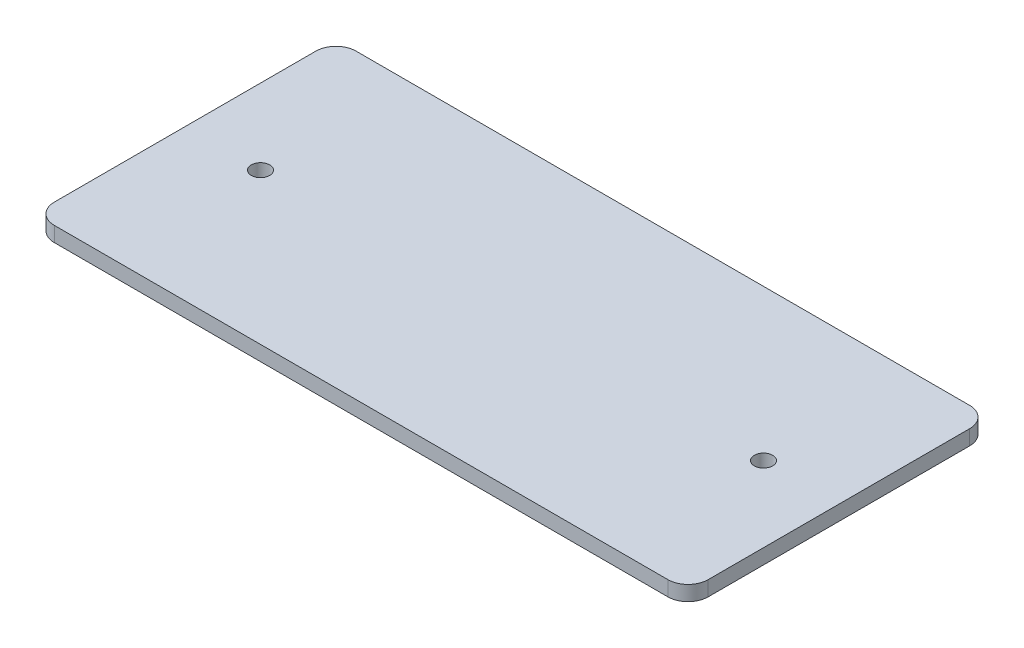
ISO-10303-21;
HEADER;
FILE_DESCRIPTION(('STEP AP214'),'2;1');
FILE_NAME('part.step','',(''),(''),'','','');
FILE_SCHEMA(('AUTOMOTIVE_DESIGN { 1 0 10303 214 1 1 1 1 }'));
ENDSEC;
DATA;
#1=APPLICATION_CONTEXT('core data for automotive mechanical design processes');
#2=APPLICATION_PROTOCOL_DEFINITION('international standard','automotive_design',2000,#1);
#3=PRODUCT_CONTEXT('',#1,'mechanical');
#4=PRODUCT('Part','Part','',(#3));
#5=PRODUCT_RELATED_PRODUCT_CATEGORY('part','',(#4));
#6=PRODUCT_DEFINITION_FORMATION('','',#4);
#7=PRODUCT_DEFINITION_CONTEXT('part definition',#1,'design');
#8=PRODUCT_DEFINITION('design','',#6,#7);
#9=PRODUCT_DEFINITION_SHAPE('','',#8);
#10=(LENGTH_UNIT() NAMED_UNIT(*) SI_UNIT(.MILLI.,.METRE.));
#11=(NAMED_UNIT(*) PLANE_ANGLE_UNIT() SI_UNIT($,.RADIAN.));
#12=(NAMED_UNIT(*) SI_UNIT($,.STERADIAN.) SOLID_ANGLE_UNIT());
#13=UNCERTAINTY_MEASURE_WITH_UNIT(LENGTH_MEASURE(1.E-05),#10,'distance_accuracy_value','');
#14=(GEOMETRIC_REPRESENTATION_CONTEXT(3) GLOBAL_UNCERTAINTY_ASSIGNED_CONTEXT((#13)) GLOBAL_UNIT_ASSIGNED_CONTEXT((#10,
#11,#12)) REPRESENTATION_CONTEXT('',''));
#15=CARTESIAN_POINT('',(0.,0.,0.));
#16=DIRECTION('',(0.,0.,1.));
#17=DIRECTION('',(1.,0.,0.));
#18=AXIS2_PLACEMENT_3D('',#15,#16,#17);
#19=CARTESIAN_POINT('',(0.,147.2438,0.));
#20=DIRECTION('',(0.,1.,0.));
#21=DIRECTION('',(0.,0.,1.));
#22=AXIS2_PLACEMENT_3D('',#19,#20,#21);
#23=PLANE('',#22);
#24=CARTESIAN_POINT('',(-50.7957697616357,147.2438,181.505943707725));
#25=DIRECTION('',(0.,1.,0.));
#26=DIRECTION('',(0.,0.,1.));
#27=AXIS2_PLACEMENT_3D('',#24,#25,#26);
#28=CIRCLE('',#27,1.82879999999999);
#29=CARTESIAN_POINT('',(-50.7957697616357,147.2438,183.334743707725));
#30=VERTEX_POINT('',#29);
#31=EDGE_CURVE('E163',#30,#30,#28,.T.);
#32=ORIENTED_EDGE('',*,*,#31,.F.);
#33=EDGE_LOOP('',(#32));
#34=FACE_BOUND('',#33,.T.);
#35=DIRECTION('',(-1.,0.,0.));
#36=VECTOR('',#35,1.);
#37=CARTESIAN_POINT('',(-65.7957697616357,147.2438,151.505943707725));
#38=LINE('',#37,#36);
#39=CARTESIAN_POINT('',(60.2042302383643,147.2438,151.505943707725));
#40=VERTEX_POINT('',#39);
#41=CARTESIAN_POINT('',(-61.7957697616357,147.2438,151.505943707725));
#42=VERTEX_POINT('',#41);
#43=EDGE_CURVE('E170',#40,#42,#38,.T.);
#44=ORIENTED_EDGE('',*,*,#43,.T.);
#45=CARTESIAN_POINT('',(-61.7957697616357,147.2438,155.505943707725));
#46=DIRECTION('',(0.,1.,0.));
#47=DIRECTION('',(0.,0.,1.));
#48=AXIS2_PLACEMENT_3D('',#45,#46,#47);
#49=CIRCLE('',#48,4.);
#50=CARTESIAN_POINT('',(-65.7957697616357,147.2438,155.505943707725));
#51=VERTEX_POINT('',#50);
#52=EDGE_CURVE('E147',#42,#51,#49,.T.);
#53=ORIENTED_EDGE('',*,*,#52,.T.);
#54=DIRECTION('',(0.,0.,1.));
#55=VECTOR('',#54,1.);
#56=CARTESIAN_POINT('',(-65.7957697616357,147.2438,151.505943707725));
#57=LINE('',#56,#55);
#58=CARTESIAN_POINT('',(-65.7957697616357,147.2438,207.505943707725));
#59=VERTEX_POINT('',#58);
#60=EDGE_CURVE('E117',#51,#59,#57,.T.);
#61=ORIENTED_EDGE('',*,*,#60,.T.);
#62=CARTESIAN_POINT('',(-61.7957697616356,147.2438,207.505943707725));
#63=DIRECTION('',(0.,1.,0.));
#64=DIRECTION('',(0.,0.,1.));
#65=AXIS2_PLACEMENT_3D('',#62,#63,#64);
#66=CIRCLE('',#65,4.);
#67=CARTESIAN_POINT('',(-61.7957697616356,147.2438,211.505943707725));
#68=VERTEX_POINT('',#67);
#69=EDGE_CURVE('E54',#59,#68,#66,.T.);
#70=ORIENTED_EDGE('',*,*,#69,.T.);
#71=DIRECTION('',(1.,0.,0.));
#72=VECTOR('',#71,1.);
#73=CARTESIAN_POINT('',(-65.7957697616357,147.2438,211.505943707725));
#74=LINE('',#73,#72);
#75=CARTESIAN_POINT('',(60.2042302383643,147.2438,211.505943707725));
#76=VERTEX_POINT('',#75);
#77=EDGE_CURVE('E133',#68,#76,#74,.T.);
#78=ORIENTED_EDGE('',*,*,#77,.T.);
#79=CARTESIAN_POINT('',(60.2042302383643,147.2438,207.505943707725));
#80=DIRECTION('',(0.,1.,0.));
#81=DIRECTION('',(0.,0.,1.));
#82=AXIS2_PLACEMENT_3D('',#79,#80,#81);
#83=CIRCLE('',#82,4.);
#84=CARTESIAN_POINT('',(64.2042302383643,147.2438,207.505943707725));
#85=VERTEX_POINT('',#84);
#86=EDGE_CURVE('E142',#76,#85,#83,.T.);
#87=ORIENTED_EDGE('',*,*,#86,.T.);
#88=DIRECTION('',(0.,0.,-1.));
#89=VECTOR('',#88,1.);
#90=CARTESIAN_POINT('',(64.2042302383643,147.2438,151.505943707725));
#91=LINE('',#90,#89);
#92=CARTESIAN_POINT('',(64.2042302383643,147.2438,155.505943707725));
#93=VERTEX_POINT('',#92);
#94=EDGE_CURVE('E127',#85,#93,#91,.T.);
#95=ORIENTED_EDGE('',*,*,#94,.T.);
#96=CARTESIAN_POINT('',(60.2042302383643,147.2438,155.505943707725));
#97=DIRECTION('',(0.,1.,0.));
#98=DIRECTION('',(0.,0.,1.));
#99=AXIS2_PLACEMENT_3D('',#96,#97,#98);
#100=CIRCLE('',#99,4.);
#101=EDGE_CURVE('E144',#93,#40,#100,.T.);
#102=ORIENTED_EDGE('',*,*,#101,.T.);
#103=EDGE_LOOP('',(#44,#53,#61,#70,#78,#87,#95,#102));
#104=FACE_BOUND('',#103,.T.);
#105=CARTESIAN_POINT('',(49.2042302383644,147.2438,181.505943707725));
#106=DIRECTION('',(0.,1.,0.));
#107=DIRECTION('',(0.,0.,1.));
#108=AXIS2_PLACEMENT_3D('',#105,#106,#107);
#109=CIRCLE('',#108,1.82879999999999);
#110=CARTESIAN_POINT('',(49.2042302383644,147.2438,183.334743707725));
#111=VERTEX_POINT('',#110);
#112=EDGE_CURVE('E175',#111,#111,#109,.T.);
#113=ORIENTED_EDGE('',*,*,#112,.F.);
#114=EDGE_LOOP('',(#113));
#115=FACE_BOUND('',#114,.T.);
#116=ADVANCED_FACE('F32',(#34,#104,#115),#23,.T.);
#117=CARTESIAN_POINT('',(0.,144.272,0.));
#118=DIRECTION('',(0.,1.,0.));
#119=DIRECTION('',(0.,0.,1.));
#120=AXIS2_PLACEMENT_3D('',#117,#118,#119);
#121=PLANE('',#120);
#122=DIRECTION('',(0.,0.,1.));
#123=VECTOR('',#122,1.);
#124=CARTESIAN_POINT('',(-65.7957697616357,144.272,151.505943707725));
#125=LINE('',#124,#123);
#126=CARTESIAN_POINT('',(-65.7957697616357,144.272,155.505943707725));
#127=VERTEX_POINT('',#126);
#128=CARTESIAN_POINT('',(-65.7957697616357,144.272,207.505943707725));
#129=VERTEX_POINT('',#128);
#130=EDGE_CURVE('E115',#127,#129,#125,.T.);
#131=ORIENTED_EDGE('',*,*,#130,.F.);
#132=CARTESIAN_POINT('',(-61.7957697616357,144.272,155.505943707725));
#133=DIRECTION('',(0.,1.,0.));
#134=DIRECTION('',(0.,0.,1.));
#135=AXIS2_PLACEMENT_3D('',#132,#133,#134);
#136=CIRCLE('',#135,4.);
#137=CARTESIAN_POINT('',(-61.7957697616357,144.272,151.505943707725));
#138=VERTEX_POINT('',#137);
#139=EDGE_CURVE('E98',#127,#138,#136,.F.);
#140=ORIENTED_EDGE('',*,*,#139,.T.);
#141=DIRECTION('',(-1.,0.,0.));
#142=VECTOR('',#141,1.);
#143=CARTESIAN_POINT('',(-65.7957697616357,144.272,151.505943707725));
#144=LINE('',#143,#142);
#145=CARTESIAN_POINT('',(60.2042302383643,144.272,151.505943707725));
#146=VERTEX_POINT('',#145);
#147=EDGE_CURVE('E125',#146,#138,#144,.T.);
#148=ORIENTED_EDGE('',*,*,#147,.F.);
#149=CARTESIAN_POINT('',(60.2042302383643,144.272,155.505943707725));
#150=DIRECTION('',(0.,1.,0.));
#151=DIRECTION('',(0.,0.,1.));
#152=AXIS2_PLACEMENT_3D('',#149,#150,#151);
#153=CIRCLE('',#152,4.);
#154=CARTESIAN_POINT('',(64.2042302383643,144.272,155.505943707725));
#155=VERTEX_POINT('',#154);
#156=EDGE_CURVE('E136',#146,#155,#153,.F.);
#157=ORIENTED_EDGE('',*,*,#156,.T.);
#158=DIRECTION('',(0.,0.,-1.));
#159=VECTOR('',#158,1.);
#160=CARTESIAN_POINT('',(64.2042302383643,144.272,151.505943707725));
#161=LINE('',#160,#159);
#162=CARTESIAN_POINT('',(64.2042302383643,144.272,207.505943707725));
#163=VERTEX_POINT('',#162);
#164=EDGE_CURVE('E129',#163,#155,#161,.T.);
#165=ORIENTED_EDGE('',*,*,#164,.F.);
#166=CARTESIAN_POINT('',(60.2042302383643,144.272,207.505943707725));
#167=DIRECTION('',(0.,1.,0.));
#168=DIRECTION('',(0.,0.,1.));
#169=AXIS2_PLACEMENT_3D('',#166,#167,#168);
#170=CIRCLE('',#169,4.);
#171=CARTESIAN_POINT('',(60.2042302383643,144.272,211.505943707725));
#172=VERTEX_POINT('',#171);
#173=EDGE_CURVE('E118',#163,#172,#170,.F.);
#174=ORIENTED_EDGE('',*,*,#173,.T.);
#175=DIRECTION('',(1.,0.,0.));
#176=VECTOR('',#175,1.);
#177=CARTESIAN_POINT('',(-65.7957697616357,144.272,211.505943707725));
#178=LINE('',#177,#176);
#179=CARTESIAN_POINT('',(-61.7957697616356,144.272,211.505943707725));
#180=VERTEX_POINT('',#179);
#181=EDGE_CURVE('E124',#180,#172,#178,.T.);
#182=ORIENTED_EDGE('',*,*,#181,.F.);
#183=CARTESIAN_POINT('',(-61.7957697616356,144.272,207.505943707725));
#184=DIRECTION('',(0.,1.,0.));
#185=DIRECTION('',(0.,0.,1.));
#186=AXIS2_PLACEMENT_3D('',#183,#184,#185);
#187=CIRCLE('',#186,4.);
#188=EDGE_CURVE('E109',#180,#129,#187,.F.);
#189=ORIENTED_EDGE('',*,*,#188,.T.);
#190=EDGE_LOOP('',(#131,#140,#148,#157,#165,#174,#182,#189));
#191=FACE_BOUND('',#190,.T.);
#192=CARTESIAN_POINT('',(-50.7957697616357,144.272,181.505943707725));
#193=DIRECTION('',(0.,1.,0.));
#194=DIRECTION('',(0.,0.,1.));
#195=AXIS2_PLACEMENT_3D('',#192,#193,#194);
#196=CIRCLE('',#195,1.82879999999999);
#197=CARTESIAN_POINT('',(-50.7957697616357,144.272,183.334743707725));
#198=VERTEX_POINT('',#197);
#199=EDGE_CURVE('E165',#198,#198,#196,.T.);
#200=ORIENTED_EDGE('',*,*,#199,.T.);
#201=EDGE_LOOP('',(#200));
#202=FACE_BOUND('',#201,.T.);
#203=CARTESIAN_POINT('',(49.2042302383644,144.272,181.505943707725));
#204=DIRECTION('',(0.,1.,0.));
#205=DIRECTION('',(0.,0.,1.));
#206=AXIS2_PLACEMENT_3D('',#203,#204,#205);
#207=CIRCLE('',#206,1.82879999999999);
#208=CARTESIAN_POINT('',(49.2042302383644,144.272,183.334743707725));
#209=VERTEX_POINT('',#208);
#210=EDGE_CURVE('E177',#209,#209,#207,.T.);
#211=ORIENTED_EDGE('',*,*,#210,.T.);
#212=EDGE_LOOP('',(#211));
#213=FACE_BOUND('',#212,.T.);
#214=ADVANCED_FACE('F121',(#191,#202,#213),#121,.F.);
#215=CARTESIAN_POINT('',(64.2042302383643,147.2438,151.505943707725));
#216=DIRECTION('',(-1.,0.,0.));
#217=DIRECTION('',(0.,0.,1.));
#218=AXIS2_PLACEMENT_3D('',#215,#216,#217);
#219=PLANE('',#218);
#220=ORIENTED_EDGE('',*,*,#164,.T.);
#221=DIRECTION('',(0.,-1.,0.));
#222=VECTOR('',#221,1.);
#223=CARTESIAN_POINT('',(64.2042302383643,147.2438,155.505943707725));
#224=LINE('',#223,#222);
#225=EDGE_CURVE('E11',#155,#93,#224,.F.);
#226=ORIENTED_EDGE('',*,*,#225,.T.);
#227=ORIENTED_EDGE('',*,*,#94,.F.);
#228=DIRECTION('',(0.,-1.,0.));
#229=VECTOR('',#228,1.);
#230=CARTESIAN_POINT('',(64.2042302383643,147.2438,207.505943707725));
#231=LINE('',#230,#229);
#232=EDGE_CURVE('E40',#85,#163,#231,.T.);
#233=ORIENTED_EDGE('',*,*,#232,.T.);
#234=EDGE_LOOP('',(#220,#226,#227,#233));
#235=FACE_BOUND('',#234,.T.);
#236=ADVANCED_FACE('F158',(#235),#219,.F.);
#237=CARTESIAN_POINT('',(-65.7957697616357,147.2438,151.505943707725));
#238=DIRECTION('',(0.,0.,1.));
#239=DIRECTION('',(1.,0.,0.));
#240=AXIS2_PLACEMENT_3D('',#237,#238,#239);
#241=PLANE('',#240);
#242=ORIENTED_EDGE('',*,*,#147,.T.);
#243=DIRECTION('',(0.,-1.,0.));
#244=VECTOR('',#243,1.);
#245=CARTESIAN_POINT('',(-61.7957697616357,147.2438,151.505943707725));
#246=LINE('',#245,#244);
#247=EDGE_CURVE('E103',#138,#42,#246,.F.);
#248=ORIENTED_EDGE('',*,*,#247,.T.);
#249=ORIENTED_EDGE('',*,*,#43,.F.);
#250=DIRECTION('',(0.,-1.,0.));
#251=VECTOR('',#250,1.);
#252=CARTESIAN_POINT('',(60.2042302383643,147.2438,151.505943707725));
#253=LINE('',#252,#251);
#254=EDGE_CURVE('E108',#40,#146,#253,.T.);
#255=ORIENTED_EDGE('',*,*,#254,.T.);
#256=EDGE_LOOP('',(#242,#248,#249,#255));
#257=FACE_BOUND('',#256,.T.);
#258=ADVANCED_FACE('F203',(#257),#241,.F.);
#259=CARTESIAN_POINT('',(-65.7957697616357,147.2438,151.505943707725));
#260=DIRECTION('',(1.,0.,0.));
#261=DIRECTION('',(0.,0.,-1.));
#262=AXIS2_PLACEMENT_3D('',#259,#260,#261);
#263=PLANE('',#262);
#264=ORIENTED_EDGE('',*,*,#60,.F.);
#265=DIRECTION('',(0.,-1.,0.));
#266=VECTOR('',#265,1.);
#267=CARTESIAN_POINT('',(-65.7957697616357,147.2438,155.505943707725));
#268=LINE('',#267,#266);
#269=EDGE_CURVE('E102',#51,#127,#268,.T.);
#270=ORIENTED_EDGE('',*,*,#269,.T.);
#271=ORIENTED_EDGE('',*,*,#130,.T.);
#272=DIRECTION('',(0.,-1.,0.));
#273=VECTOR('',#272,1.);
#274=CARTESIAN_POINT('',(-65.7957697616357,147.2438,207.505943707725));
#275=LINE('',#274,#273);
#276=EDGE_CURVE('E119',#129,#59,#275,.F.);
#277=ORIENTED_EDGE('',*,*,#276,.T.);
#278=EDGE_LOOP('',(#264,#270,#271,#277));
#279=FACE_BOUND('',#278,.T.);
#280=ADVANCED_FACE('F114',(#279),#263,.F.);
#281=CARTESIAN_POINT('',(-65.7957697616357,147.2438,211.505943707725));
#282=DIRECTION('',(0.,0.,-1.));
#283=DIRECTION('',(-1.,0.,0.));
#284=AXIS2_PLACEMENT_3D('',#281,#282,#283);
#285=PLANE('',#284);
#286=ORIENTED_EDGE('',*,*,#77,.F.);
#287=DIRECTION('',(0.,-1.,0.));
#288=VECTOR('',#287,1.);
#289=CARTESIAN_POINT('',(-61.7957697616356,147.2438,211.505943707725));
#290=LINE('',#289,#288);
#291=EDGE_CURVE('E150',#68,#180,#290,.T.);
#292=ORIENTED_EDGE('',*,*,#291,.T.);
#293=ORIENTED_EDGE('',*,*,#181,.T.);
#294=DIRECTION('',(0.,-1.,0.));
#295=VECTOR('',#294,1.);
#296=CARTESIAN_POINT('',(60.2042302383643,147.2438,211.505943707725));
#297=LINE('',#296,#295);
#298=EDGE_CURVE('E47',#172,#76,#297,.F.);
#299=ORIENTED_EDGE('',*,*,#298,.T.);
#300=EDGE_LOOP('',(#286,#292,#293,#299));
#301=FACE_BOUND('',#300,.T.);
#302=ADVANCED_FACE('F198',(#301),#285,.F.);
#303=CARTESIAN_POINT('',(-50.7957697616357,147.2438,181.505943707725));
#304=DIRECTION('',(0.,-1.,0.));
#305=DIRECTION('',(0.,0.,-1.));
#306=AXIS2_PLACEMENT_3D('',#303,#304,#305);
#307=CYLINDRICAL_SURFACE('',#306,1.82879999999999);
#308=ORIENTED_EDGE('',*,*,#31,.T.);
#309=EDGE_LOOP('',(#308));
#310=FACE_BOUND('',#309,.T.);
#311=ORIENTED_EDGE('',*,*,#199,.F.);
#312=EDGE_LOOP('',(#311));
#313=FACE_BOUND('',#312,.T.);
#314=ADVANCED_FACE('F195',(#310,#313),#307,.F.);
#315=CARTESIAN_POINT('',(49.2042302383644,147.2438,181.505943707725));
#316=DIRECTION('',(0.,-1.,0.));
#317=DIRECTION('',(0.,0.,-1.));
#318=AXIS2_PLACEMENT_3D('',#315,#316,#317);
#319=CYLINDRICAL_SURFACE('',#318,1.82879999999999);
#320=ORIENTED_EDGE('',*,*,#112,.T.);
#321=EDGE_LOOP('',(#320));
#322=FACE_BOUND('',#321,.T.);
#323=ORIENTED_EDGE('',*,*,#210,.F.);
#324=EDGE_LOOP('',(#323));
#325=FACE_BOUND('',#324,.T.);
#326=ADVANCED_FACE('F183',(#322,#325),#319,.F.);
#327=CARTESIAN_POINT('',(-61.7957697616357,147.2438,155.505943707725));
#328=DIRECTION('',(0.,-1.,0.));
#329=DIRECTION('',(0.,0.,-1.));
#330=AXIS2_PLACEMENT_3D('',#327,#328,#329);
#331=CYLINDRICAL_SURFACE('',#330,4.);
#332=ORIENTED_EDGE('',*,*,#52,.F.);
#333=ORIENTED_EDGE('',*,*,#247,.F.);
#334=ORIENTED_EDGE('',*,*,#139,.F.);
#335=ORIENTED_EDGE('',*,*,#269,.F.);
#336=EDGE_LOOP('',(#332,#333,#334,#335));
#337=FACE_BOUND('',#336,.T.);
#338=ADVANCED_FACE('F101',(#337),#331,.T.);
#339=CARTESIAN_POINT('',(-61.7957697616356,147.2438,207.505943707725));
#340=DIRECTION('',(0.,-1.,0.));
#341=DIRECTION('',(0.,0.,-1.));
#342=AXIS2_PLACEMENT_3D('',#339,#340,#341);
#343=CYLINDRICAL_SURFACE('',#342,4.);
#344=ORIENTED_EDGE('',*,*,#69,.F.);
#345=ORIENTED_EDGE('',*,*,#276,.F.);
#346=ORIENTED_EDGE('',*,*,#188,.F.);
#347=ORIENTED_EDGE('',*,*,#291,.F.);
#348=EDGE_LOOP('',(#344,#345,#346,#347));
#349=FACE_BOUND('',#348,.T.);
#350=ADVANCED_FACE('F211',(#349),#343,.T.);
#351=CARTESIAN_POINT('',(60.2042302383643,147.2438,155.505943707725));
#352=DIRECTION('',(0.,-1.,0.));
#353=DIRECTION('',(0.,0.,-1.));
#354=AXIS2_PLACEMENT_3D('',#351,#352,#353);
#355=CYLINDRICAL_SURFACE('',#354,4.);
#356=ORIENTED_EDGE('',*,*,#101,.F.);
#357=ORIENTED_EDGE('',*,*,#225,.F.);
#358=ORIENTED_EDGE('',*,*,#156,.F.);
#359=ORIENTED_EDGE('',*,*,#254,.F.);
#360=EDGE_LOOP('',(#356,#357,#358,#359));
#361=FACE_BOUND('',#360,.T.);
#362=ADVANCED_FACE('F213',(#361),#355,.T.);
#363=CARTESIAN_POINT('',(60.2042302383643,147.2438,207.505943707725));
#364=DIRECTION('',(0.,-1.,0.));
#365=DIRECTION('',(0.,0.,-1.));
#366=AXIS2_PLACEMENT_3D('',#363,#364,#365);
#367=CYLINDRICAL_SURFACE('',#366,4.);
#368=ORIENTED_EDGE('',*,*,#86,.F.);
#369=ORIENTED_EDGE('',*,*,#298,.F.);
#370=ORIENTED_EDGE('',*,*,#173,.F.);
#371=ORIENTED_EDGE('',*,*,#232,.F.);
#372=EDGE_LOOP('',(#368,#369,#370,#371));
#373=FACE_BOUND('',#372,.T.);
#374=ADVANCED_FACE('F34',(#373),#367,.T.);
#375=CLOSED_SHELL('',(#116,#214,#236,#258,#280,#302,#314,#326,#338,#350,#362,#374));
#376=MANIFOLD_SOLID_BREP('B2',#375);
#377=ADVANCED_BREP_SHAPE_REPRESENTATION('',(#18,#376),#14);
#378=SHAPE_DEFINITION_REPRESENTATION(#9,#377);
ENDSEC;
END-ISO-10303-21;
